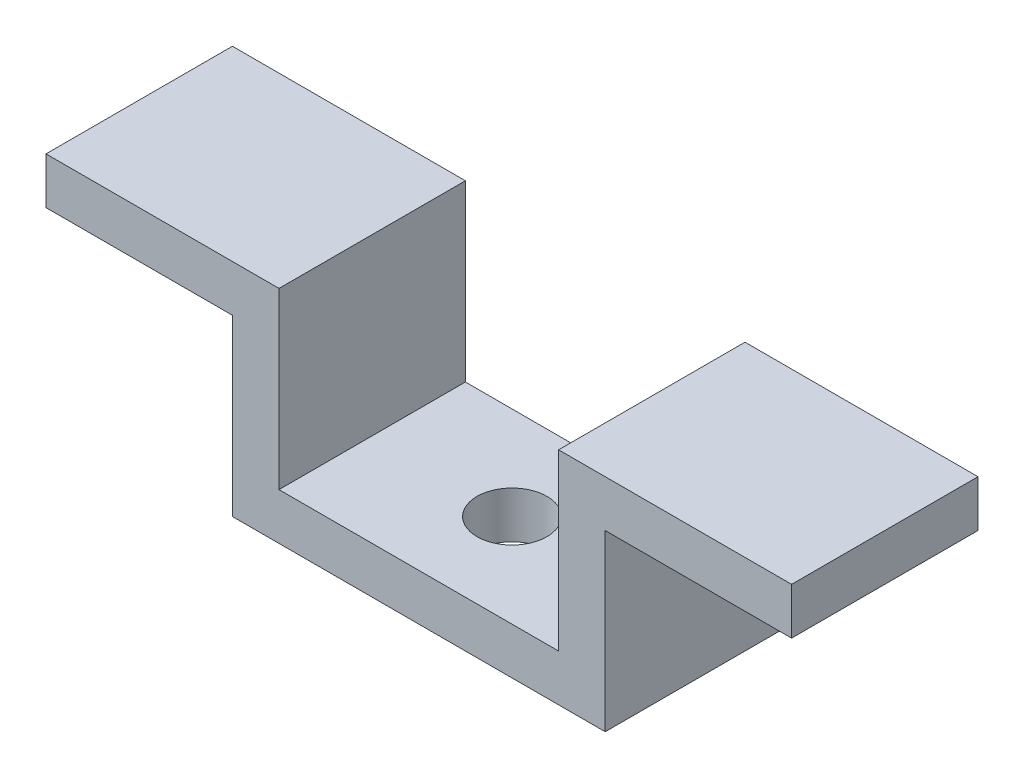
ISO-10303-21;
HEADER;
FILE_DESCRIPTION(('STEP AP214'),'2;1');
FILE_NAME('part.step','',(''),(''),'','','');
FILE_SCHEMA(('AUTOMOTIVE_DESIGN { 1 0 10303 214 1 1 1 1 }'));
ENDSEC;
DATA;
#1=APPLICATION_CONTEXT('core data for automotive mechanical design processes');
#2=APPLICATION_PROTOCOL_DEFINITION('international standard','automotive_design',2000,#1);
#3=PRODUCT_CONTEXT('',#1,'mechanical');
#4=PRODUCT('Part','Part','',(#3));
#5=PRODUCT_RELATED_PRODUCT_CATEGORY('part','',(#4));
#6=PRODUCT_DEFINITION_FORMATION('','',#4);
#7=PRODUCT_DEFINITION_CONTEXT('part definition',#1,'design');
#8=PRODUCT_DEFINITION('design','',#6,#7);
#9=PRODUCT_DEFINITION_SHAPE('','',#8);
#10=(LENGTH_UNIT() NAMED_UNIT(*) SI_UNIT(.MILLI.,.METRE.));
#11=(NAMED_UNIT(*) PLANE_ANGLE_UNIT() SI_UNIT($,.RADIAN.));
#12=(NAMED_UNIT(*) SI_UNIT($,.STERADIAN.) SOLID_ANGLE_UNIT());
#13=UNCERTAINTY_MEASURE_WITH_UNIT(LENGTH_MEASURE(1.E-05),#10,'distance_accuracy_value','');
#14=(GEOMETRIC_REPRESENTATION_CONTEXT(3) GLOBAL_UNCERTAINTY_ASSIGNED_CONTEXT((#13)) GLOBAL_UNIT_ASSIGNED_CONTEXT((#10,
#11,#12)) REPRESENTATION_CONTEXT('',''));
#15=CARTESIAN_POINT('',(0.,0.,0.));
#16=DIRECTION('',(0.,0.,1.));
#17=DIRECTION('',(1.,0.,0.));
#18=AXIS2_PLACEMENT_3D('',#15,#16,#17);
#19=CARTESIAN_POINT('',(0.,0.,25.4));
#20=DIRECTION('',(0.,1.,0.));
#21=DIRECTION('',(0.,0.,1.));
#22=AXIS2_PLACEMENT_3D('',#19,#20,#21);
#23=PLANE('',#22);
#24=CARTESIAN_POINT('',(0.,0.,12.7));
#25=DIRECTION('',(0.,1.,0.));
#26=DIRECTION('',(0.,0.,1.));
#27=AXIS2_PLACEMENT_3D('',#24,#25,#26);
#28=CIRCLE('',#27,4.7625);
#29=CARTESIAN_POINT('',(0.,0.,17.4625));
#30=VERTEX_POINT('',#29);
#31=EDGE_CURVE('E240',#30,#30,#28,.F.);
#32=ORIENTED_EDGE('',*,*,#31,.F.);
#33=EDGE_LOOP('',(#32));
#34=FACE_BOUND('',#33,.T.);
#35=DIRECTION('',(1.,0.,0.));
#36=VECTOR('',#35,1.);
#37=CARTESIAN_POINT('',(0.,0.,0.));
#38=LINE('',#37,#36);
#39=CARTESIAN_POINT('',(-25.4,0.,0.));
#40=VERTEX_POINT('',#39);
#41=CARTESIAN_POINT('',(25.4,0.,0.));
#42=VERTEX_POINT('',#41);
#43=EDGE_CURVE('E136',#40,#42,#38,.T.);
#44=ORIENTED_EDGE('',*,*,#43,.T.);
#45=DIRECTION('',(0.,0.,-1.));
#46=VECTOR('',#45,1.);
#47=CARTESIAN_POINT('',(25.4,0.,25.4));
#48=LINE('',#47,#46);
#49=CARTESIAN_POINT('',(25.4,0.,25.4));
#50=VERTEX_POINT('',#49);
#51=EDGE_CURVE('E11',#50,#42,#48,.T.);
#52=ORIENTED_EDGE('',*,*,#51,.F.);
#53=DIRECTION('',(1.,0.,0.));
#54=VECTOR('',#53,1.);
#55=CARTESIAN_POINT('',(0.,0.,25.4));
#56=LINE('',#55,#54);
#57=CARTESIAN_POINT('',(-25.4,0.,25.4));
#58=VERTEX_POINT('',#57);
#59=EDGE_CURVE('E94',#58,#50,#56,.T.);
#60=ORIENTED_EDGE('',*,*,#59,.F.);
#61=DIRECTION('',(0.,0.,-1.));
#62=VECTOR('',#61,1.);
#63=CARTESIAN_POINT('',(-25.4,0.,25.4));
#64=LINE('',#63,#62);
#65=EDGE_CURVE('E140',#58,#40,#64,.T.);
#66=ORIENTED_EDGE('',*,*,#65,.T.);
#67=EDGE_LOOP('',(#44,#52,#60,#66));
#68=FACE_BOUND('',#67,.T.);
#69=ADVANCED_FACE('F39',(#34,#68),#23,.F.);
#70=CARTESIAN_POINT('',(25.4,0.,25.4));
#71=DIRECTION('',(-1.,0.,0.));
#72=DIRECTION('',(0.,0.,1.));
#73=AXIS2_PLACEMENT_3D('',#70,#71,#72);
#74=PLANE('',#73);
#75=DIRECTION('',(0.,1.,0.));
#76=VECTOR('',#75,1.);
#77=CARTESIAN_POINT('',(25.4,0.,0.));
#78=LINE('',#77,#76);
#79=CARTESIAN_POINT('',(25.4,23.749,0.));
#80=VERTEX_POINT('',#79);
#81=EDGE_CURVE('E139',#42,#80,#78,.T.);
#82=ORIENTED_EDGE('',*,*,#81,.T.);
#83=DIRECTION('',(0.,0.,-1.));
#84=VECTOR('',#83,1.);
#85=CARTESIAN_POINT('',(25.4,23.749,25.4));
#86=LINE('',#85,#84);
#87=CARTESIAN_POINT('',(25.4,23.749,25.4));
#88=VERTEX_POINT('',#87);
#89=EDGE_CURVE('E48',#88,#80,#86,.T.);
#90=ORIENTED_EDGE('',*,*,#89,.F.);
#91=DIRECTION('',(0.,1.,0.));
#92=VECTOR('',#91,1.);
#93=CARTESIAN_POINT('',(25.4,0.,25.4));
#94=LINE('',#93,#92);
#95=EDGE_CURVE('E221',#50,#88,#94,.T.);
#96=ORIENTED_EDGE('',*,*,#95,.F.);
#97=ORIENTED_EDGE('',*,*,#51,.T.);
#98=EDGE_LOOP('',(#82,#90,#96,#97));
#99=FACE_BOUND('',#98,.T.);
#100=ADVANCED_FACE('F224',(#99),#74,.F.);
#101=CARTESIAN_POINT('',(25.4,23.749,25.4));
#102=DIRECTION('',(0.,1.,0.));
#103=DIRECTION('',(0.,0.,1.));
#104=AXIS2_PLACEMENT_3D('',#101,#102,#103);
#105=PLANE('',#104);
#106=DIRECTION('',(1.,0.,0.));
#107=VECTOR('',#106,1.);
#108=CARTESIAN_POINT('',(25.4,23.749,0.));
#109=LINE('',#108,#107);
#110=CARTESIAN_POINT('',(50.8,23.749,0.));
#111=VERTEX_POINT('',#110);
#112=EDGE_CURVE('E143',#80,#111,#109,.T.);
#113=ORIENTED_EDGE('',*,*,#112,.T.);
#114=DIRECTION('',(0.,0.,-1.));
#115=VECTOR('',#114,1.);
#116=CARTESIAN_POINT('',(50.8,23.749,25.4));
#117=LINE('',#116,#115);
#118=CARTESIAN_POINT('',(50.8,23.749,25.4));
#119=VERTEX_POINT('',#118);
#120=EDGE_CURVE('E122',#119,#111,#117,.T.);
#121=ORIENTED_EDGE('',*,*,#120,.F.);
#122=DIRECTION('',(1.,0.,0.));
#123=VECTOR('',#122,1.);
#124=CARTESIAN_POINT('',(25.4,23.749,25.4));
#125=LINE('',#124,#123);
#126=EDGE_CURVE('E111',#88,#119,#125,.T.);
#127=ORIENTED_EDGE('',*,*,#126,.F.);
#128=ORIENTED_EDGE('',*,*,#89,.T.);
#129=EDGE_LOOP('',(#113,#121,#127,#128));
#130=FACE_BOUND('',#129,.T.);
#131=ADVANCED_FACE('F166',(#130),#105,.F.);
#132=CARTESIAN_POINT('',(50.8,23.749,25.4));
#133=DIRECTION('',(-1.,0.,0.));
#134=DIRECTION('',(0.,0.,1.));
#135=AXIS2_PLACEMENT_3D('',#132,#133,#134);
#136=PLANE('',#135);
#137=DIRECTION('',(0.,1.,0.));
#138=VECTOR('',#137,1.);
#139=CARTESIAN_POINT('',(50.8,23.749,0.));
#140=LINE('',#139,#138);
#141=CARTESIAN_POINT('',(50.8,30.099,0.));
#142=VERTEX_POINT('',#141);
#143=EDGE_CURVE('E120',#111,#142,#140,.T.);
#144=ORIENTED_EDGE('',*,*,#143,.T.);
#145=DIRECTION('',(0.,0.,-1.));
#146=VECTOR('',#145,1.);
#147=CARTESIAN_POINT('',(50.8,30.099,25.4));
#148=LINE('',#147,#146);
#149=CARTESIAN_POINT('',(50.8,30.099,25.4));
#150=VERTEX_POINT('',#149);
#151=EDGE_CURVE('E117',#150,#142,#148,.T.);
#152=ORIENTED_EDGE('',*,*,#151,.F.);
#153=DIRECTION('',(0.,1.,0.));
#154=VECTOR('',#153,1.);
#155=CARTESIAN_POINT('',(50.8,23.749,25.4));
#156=LINE('',#155,#154);
#157=EDGE_CURVE('E105',#119,#150,#156,.T.);
#158=ORIENTED_EDGE('',*,*,#157,.F.);
#159=ORIENTED_EDGE('',*,*,#120,.T.);
#160=EDGE_LOOP('',(#144,#152,#158,#159));
#161=FACE_BOUND('',#160,.T.);
#162=ADVANCED_FACE('F118',(#161),#136,.F.);
#163=CARTESIAN_POINT('',(50.8,30.099,25.4));
#164=DIRECTION('',(0.,-1.,0.));
#165=DIRECTION('',(1.,0.,0.));
#166=AXIS2_PLACEMENT_3D('',#163,#164,#165);
#167=PLANE('',#166);
#168=DIRECTION('',(-1.,0.,0.));
#169=VECTOR('',#168,1.);
#170=CARTESIAN_POINT('',(50.8,30.099,0.));
#171=LINE('',#170,#169);
#172=CARTESIAN_POINT('',(19.05,30.099,0.));
#173=VERTEX_POINT('',#172);
#174=EDGE_CURVE('E80',#142,#173,#171,.T.);
#175=ORIENTED_EDGE('',*,*,#174,.T.);
#176=DIRECTION('',(0.,0.,-1.));
#177=VECTOR('',#176,1.);
#178=CARTESIAN_POINT('',(19.05,30.099,25.4));
#179=LINE('',#178,#177);
#180=CARTESIAN_POINT('',(19.05,30.099,25.4));
#181=VERTEX_POINT('',#180);
#182=EDGE_CURVE('E123',#181,#173,#179,.T.);
#183=ORIENTED_EDGE('',*,*,#182,.F.);
#184=DIRECTION('',(-1.,0.,0.));
#185=VECTOR('',#184,1.);
#186=CARTESIAN_POINT('',(50.8,30.099,25.4));
#187=LINE('',#186,#185);
#188=EDGE_CURVE('E109',#150,#181,#187,.T.);
#189=ORIENTED_EDGE('',*,*,#188,.F.);
#190=ORIENTED_EDGE('',*,*,#151,.T.);
#191=EDGE_LOOP('',(#175,#183,#189,#190));
#192=FACE_BOUND('',#191,.T.);
#193=ADVANCED_FACE('F125',(#192),#167,.F.);
#194=CARTESIAN_POINT('',(19.05,30.099,25.4));
#195=DIRECTION('',(1.,0.,0.));
#196=DIRECTION('',(0.,1.,0.));
#197=AXIS2_PLACEMENT_3D('',#194,#195,#196);
#198=PLANE('',#197);
#199=DIRECTION('',(0.,-1.,0.));
#200=VECTOR('',#199,1.);
#201=CARTESIAN_POINT('',(19.05,30.099,0.));
#202=LINE('',#201,#200);
#203=CARTESIAN_POINT('',(19.05,6.35,0.));
#204=VERTEX_POINT('',#203);
#205=EDGE_CURVE('E86',#173,#204,#202,.T.);
#206=ORIENTED_EDGE('',*,*,#205,.T.);
#207=DIRECTION('',(0.,0.,-1.));
#208=VECTOR('',#207,1.);
#209=CARTESIAN_POINT('',(19.05,6.35,25.4));
#210=LINE('',#209,#208);
#211=CARTESIAN_POINT('',(19.05,6.35,25.4));
#212=VERTEX_POINT('',#211);
#213=EDGE_CURVE('E135',#212,#204,#210,.T.);
#214=ORIENTED_EDGE('',*,*,#213,.F.);
#215=DIRECTION('',(0.,-1.,0.));
#216=VECTOR('',#215,1.);
#217=CARTESIAN_POINT('',(19.05,30.099,25.4));
#218=LINE('',#217,#216);
#219=EDGE_CURVE('E56',#181,#212,#218,.T.);
#220=ORIENTED_EDGE('',*,*,#219,.F.);
#221=ORIENTED_EDGE('',*,*,#182,.T.);
#222=EDGE_LOOP('',(#206,#214,#220,#221));
#223=FACE_BOUND('',#222,.T.);
#224=ADVANCED_FACE('F348',(#223),#198,.F.);
#225=CARTESIAN_POINT('',(19.05,6.35,25.4));
#226=DIRECTION('',(0.,-1.,0.));
#227=DIRECTION('',(1.,0.,0.));
#228=AXIS2_PLACEMENT_3D('',#225,#226,#227);
#229=PLANE('',#228);
#230=CARTESIAN_POINT('',(0.,6.35,12.7));
#231=DIRECTION('',(0.,1.,0.));
#232=DIRECTION('',(-1.,0.,0.));
#233=AXIS2_PLACEMENT_3D('',#230,#231,#232);
#234=CIRCLE('',#233,4.7625);
#235=CARTESIAN_POINT('',(-4.7625,6.35,12.7));
#236=VERTEX_POINT('',#235);
#237=EDGE_CURVE('E247',#236,#236,#234,.T.);
#238=ORIENTED_EDGE('',*,*,#237,.F.);
#239=EDGE_LOOP('',(#238));
#240=FACE_BOUND('',#239,.T.);
#241=DIRECTION('',(-1.,0.,0.));
#242=VECTOR('',#241,1.);
#243=CARTESIAN_POINT('',(19.05,6.35,0.));
#244=LINE('',#243,#242);
#245=CARTESIAN_POINT('',(-19.05,6.35,0.));
#246=VERTEX_POINT('',#245);
#247=EDGE_CURVE('E152',#204,#246,#244,.T.);
#248=ORIENTED_EDGE('',*,*,#247,.T.);
#249=DIRECTION('',(0.,0.,-1.));
#250=VECTOR('',#249,1.);
#251=CARTESIAN_POINT('',(-19.05,6.35,25.4));
#252=LINE('',#251,#250);
#253=CARTESIAN_POINT('',(-19.05,6.35,25.4));
#254=VERTEX_POINT('',#253);
#255=EDGE_CURVE('E183',#254,#246,#252,.T.);
#256=ORIENTED_EDGE('',*,*,#255,.F.);
#257=DIRECTION('',(-1.,0.,0.));
#258=VECTOR('',#257,1.);
#259=CARTESIAN_POINT('',(19.05,6.35,25.4));
#260=LINE('',#259,#258);
#261=EDGE_CURVE('E129',#212,#254,#260,.T.);
#262=ORIENTED_EDGE('',*,*,#261,.F.);
#263=ORIENTED_EDGE('',*,*,#213,.T.);
#264=EDGE_LOOP('',(#248,#256,#262,#263));
#265=FACE_BOUND('',#264,.T.);
#266=ADVANCED_FACE('F181',(#240,#265),#229,.F.);
#267=CARTESIAN_POINT('',(0.,0.,25.4));
#268=DIRECTION('',(0.,0.,1.));
#269=DIRECTION('',(1.,0.,0.));
#270=AXIS2_PLACEMENT_3D('',#267,#268,#269);
#271=PLANE('',#270);
#272=ORIENTED_EDGE('',*,*,#261,.T.);
#273=DIRECTION('',(0.,-1.,0.));
#274=VECTOR('',#273,1.);
#275=CARTESIAN_POINT('',(-19.05,30.099,25.4));
#276=LINE('',#275,#274);
#277=CARTESIAN_POINT('',(-19.05,30.099,25.4));
#278=VERTEX_POINT('',#277);
#279=EDGE_CURVE('E192',#278,#254,#276,.T.);
#280=ORIENTED_EDGE('',*,*,#279,.F.);
#281=DIRECTION('',(1.,0.,0.));
#282=VECTOR('',#281,1.);
#283=CARTESIAN_POINT('',(-50.8,30.099,25.4));
#284=LINE('',#283,#282);
#285=CARTESIAN_POINT('',(-50.8,30.099,25.4));
#286=VERTEX_POINT('',#285);
#287=EDGE_CURVE('E200',#286,#278,#284,.T.);
#288=ORIENTED_EDGE('',*,*,#287,.F.);
#289=DIRECTION('',(0.,1.,0.));
#290=VECTOR('',#289,1.);
#291=CARTESIAN_POINT('',(-50.8,23.749,25.4));
#292=LINE('',#291,#290);
#293=CARTESIAN_POINT('',(-50.8,23.749,25.4));
#294=VERTEX_POINT('',#293);
#295=EDGE_CURVE('E264',#294,#286,#292,.T.);
#296=ORIENTED_EDGE('',*,*,#295,.F.);
#297=DIRECTION('',(-1.,0.,0.));
#298=VECTOR('',#297,1.);
#299=CARTESIAN_POINT('',(-25.4,23.749,25.4));
#300=LINE('',#299,#298);
#301=CARTESIAN_POINT('',(-25.4,23.749,25.4));
#302=VERTEX_POINT('',#301);
#303=EDGE_CURVE('E259',#302,#294,#300,.T.);
#304=ORIENTED_EDGE('',*,*,#303,.F.);
#305=DIRECTION('',(0.,1.,0.));
#306=VECTOR('',#305,1.);
#307=CARTESIAN_POINT('',(-25.4,0.,25.4));
#308=LINE('',#307,#306);
#309=EDGE_CURVE('E257',#58,#302,#308,.T.);
#310=ORIENTED_EDGE('',*,*,#309,.F.);
#311=ORIENTED_EDGE('',*,*,#59,.T.);
#312=ORIENTED_EDGE('',*,*,#95,.T.);
#313=ORIENTED_EDGE('',*,*,#126,.T.);
#314=ORIENTED_EDGE('',*,*,#157,.T.);
#315=ORIENTED_EDGE('',*,*,#188,.T.);
#316=ORIENTED_EDGE('',*,*,#219,.T.);
#317=EDGE_LOOP('',(#272,#280,#288,#296,#304,#310,#311,#312,#313,#314,#315,#316));
#318=FACE_BOUND('',#317,.T.);
#319=ADVANCED_FACE('F107',(#318),#271,.T.);
#320=CARTESIAN_POINT('',(0.,0.,0.));
#321=DIRECTION('',(0.,0.,1.));
#322=DIRECTION('',(1.,0.,0.));
#323=AXIS2_PLACEMENT_3D('',#320,#321,#322);
#324=PLANE('',#323);
#325=ORIENTED_EDGE('',*,*,#43,.F.);
#326=DIRECTION('',(0.,1.,0.));
#327=VECTOR('',#326,1.);
#328=CARTESIAN_POINT('',(-25.4,0.,0.));
#329=LINE('',#328,#327);
#330=CARTESIAN_POINT('',(-25.4,23.749,0.));
#331=VERTEX_POINT('',#330);
#332=EDGE_CURVE('E232',#40,#331,#329,.T.);
#333=ORIENTED_EDGE('',*,*,#332,.T.);
#334=DIRECTION('',(-1.,0.,0.));
#335=VECTOR('',#334,1.);
#336=CARTESIAN_POINT('',(-25.4,23.749,0.));
#337=LINE('',#336,#335);
#338=CARTESIAN_POINT('',(-50.8,23.749,0.));
#339=VERTEX_POINT('',#338);
#340=EDGE_CURVE('E239',#331,#339,#337,.T.);
#341=ORIENTED_EDGE('',*,*,#340,.T.);
#342=DIRECTION('',(0.,1.,0.));
#343=VECTOR('',#342,1.);
#344=CARTESIAN_POINT('',(-50.8,23.749,0.));
#345=LINE('',#344,#343);
#346=CARTESIAN_POINT('',(-50.8,30.099,0.));
#347=VERTEX_POINT('',#346);
#348=EDGE_CURVE('E244',#339,#347,#345,.T.);
#349=ORIENTED_EDGE('',*,*,#348,.T.);
#350=DIRECTION('',(1.,0.,0.));
#351=VECTOR('',#350,1.);
#352=CARTESIAN_POINT('',(-50.8,30.099,0.));
#353=LINE('',#352,#351);
#354=CARTESIAN_POINT('',(-19.05,30.099,0.));
#355=VERTEX_POINT('',#354);
#356=EDGE_CURVE('E253',#347,#355,#353,.T.);
#357=ORIENTED_EDGE('',*,*,#356,.T.);
#358=DIRECTION('',(0.,-1.,0.));
#359=VECTOR('',#358,1.);
#360=CARTESIAN_POINT('',(-19.05,30.099,0.));
#361=LINE('',#360,#359);
#362=EDGE_CURVE('E177',#355,#246,#361,.T.);
#363=ORIENTED_EDGE('',*,*,#362,.T.);
#364=ORIENTED_EDGE('',*,*,#247,.F.);
#365=ORIENTED_EDGE('',*,*,#205,.F.);
#366=ORIENTED_EDGE('',*,*,#174,.F.);
#367=ORIENTED_EDGE('',*,*,#143,.F.);
#368=ORIENTED_EDGE('',*,*,#112,.F.);
#369=ORIENTED_EDGE('',*,*,#81,.F.);
#370=EDGE_LOOP('',(#325,#333,#341,#349,#357,#363,#364,#365,#366,#367,#368,#369));
#371=FACE_BOUND('',#370,.T.);
#372=ADVANCED_FACE('F172',(#371),#324,.F.);
#373=CARTESIAN_POINT('',(-25.4,0.,25.4));
#374=DIRECTION('',(1.,0.,0.));
#375=DIRECTION('',(0.,0.,1.));
#376=AXIS2_PLACEMENT_3D('',#373,#374,#375);
#377=PLANE('',#376);
#378=ORIENTED_EDGE('',*,*,#332,.F.);
#379=ORIENTED_EDGE('',*,*,#65,.F.);
#380=ORIENTED_EDGE('',*,*,#309,.T.);
#381=DIRECTION('',(0.,0.,-1.));
#382=VECTOR('',#381,1.);
#383=CARTESIAN_POINT('',(-25.4,23.749,25.4));
#384=LINE('',#383,#382);
#385=EDGE_CURVE('E212',#302,#331,#384,.T.);
#386=ORIENTED_EDGE('',*,*,#385,.T.);
#387=EDGE_LOOP('',(#378,#379,#380,#386));
#388=FACE_BOUND('',#387,.T.);
#389=ADVANCED_FACE('F235',(#388),#377,.F.);
#390=CARTESIAN_POINT('',(-25.4,23.749,25.4));
#391=DIRECTION('',(0.,1.,0.));
#392=DIRECTION('',(0.,0.,1.));
#393=AXIS2_PLACEMENT_3D('',#390,#391,#392);
#394=PLANE('',#393);
#395=ORIENTED_EDGE('',*,*,#340,.F.);
#396=ORIENTED_EDGE('',*,*,#385,.F.);
#397=ORIENTED_EDGE('',*,*,#303,.T.);
#398=DIRECTION('',(0.,0.,-1.));
#399=VECTOR('',#398,1.);
#400=CARTESIAN_POINT('',(-50.8,23.749,25.4));
#401=LINE('',#400,#399);
#402=EDGE_CURVE('E208',#294,#339,#401,.T.);
#403=ORIENTED_EDGE('',*,*,#402,.T.);
#404=EDGE_LOOP('',(#395,#396,#397,#403));
#405=FACE_BOUND('',#404,.T.);
#406=ADVANCED_FACE('F297',(#405),#394,.F.);
#407=CARTESIAN_POINT('',(-50.8,23.749,25.4));
#408=DIRECTION('',(1.,0.,0.));
#409=DIRECTION('',(0.,0.,1.));
#410=AXIS2_PLACEMENT_3D('',#407,#408,#409);
#411=PLANE('',#410);
#412=ORIENTED_EDGE('',*,*,#348,.F.);
#413=ORIENTED_EDGE('',*,*,#402,.F.);
#414=ORIENTED_EDGE('',*,*,#295,.T.);
#415=DIRECTION('',(0.,0.,-1.));
#416=VECTOR('',#415,1.);
#417=CARTESIAN_POINT('',(-50.8,30.099,25.4));
#418=LINE('',#417,#416);
#419=EDGE_CURVE('E198',#286,#347,#418,.T.);
#420=ORIENTED_EDGE('',*,*,#419,.T.);
#421=EDGE_LOOP('',(#412,#413,#414,#420));
#422=FACE_BOUND('',#421,.T.);
#423=ADVANCED_FACE('F295',(#422),#411,.F.);
#424=CARTESIAN_POINT('',(-50.8,30.099,25.4));
#425=DIRECTION('',(0.,-1.,0.));
#426=DIRECTION('',(-1.,0.,0.));
#427=AXIS2_PLACEMENT_3D('',#424,#425,#426);
#428=PLANE('',#427);
#429=ORIENTED_EDGE('',*,*,#356,.F.);
#430=ORIENTED_EDGE('',*,*,#419,.F.);
#431=ORIENTED_EDGE('',*,*,#287,.T.);
#432=DIRECTION('',(0.,0.,-1.));
#433=VECTOR('',#432,1.);
#434=CARTESIAN_POINT('',(-19.05,30.099,25.4));
#435=LINE('',#434,#433);
#436=EDGE_CURVE('E194',#278,#355,#435,.T.);
#437=ORIENTED_EDGE('',*,*,#436,.T.);
#438=EDGE_LOOP('',(#429,#430,#431,#437));
#439=FACE_BOUND('',#438,.T.);
#440=ADVANCED_FACE('F276',(#439),#428,.F.);
#441=CARTESIAN_POINT('',(-19.05,30.099,25.4));
#442=DIRECTION('',(-1.,0.,0.));
#443=DIRECTION('',(0.,1.,0.));
#444=AXIS2_PLACEMENT_3D('',#441,#442,#443);
#445=PLANE('',#444);
#446=ORIENTED_EDGE('',*,*,#362,.F.);
#447=ORIENTED_EDGE('',*,*,#436,.F.);
#448=ORIENTED_EDGE('',*,*,#279,.T.);
#449=ORIENTED_EDGE('',*,*,#255,.T.);
#450=EDGE_LOOP('',(#446,#447,#448,#449));
#451=FACE_BOUND('',#450,.T.);
#452=ADVANCED_FACE('F188',(#451),#445,.F.);
#453=CARTESIAN_POINT('',(0.,-0.00100000000000534,12.7));
#454=DIRECTION('',(0.,1.,0.));
#455=DIRECTION('',(-1.,0.,0.));
#456=AXIS2_PLACEMENT_3D('',#453,#454,#455);
#457=CYLINDRICAL_SURFACE('',#456,4.7625);
#458=ORIENTED_EDGE('',*,*,#237,.T.);
#459=EDGE_LOOP('',(#458));
#460=FACE_BOUND('',#459,.T.);
#461=ORIENTED_EDGE('',*,*,#31,.T.);
#462=EDGE_LOOP('',(#461));
#463=FACE_BOUND('',#462,.T.);
#464=ADVANCED_FACE('F314',(#460,#463),#457,.F.);
#465=CLOSED_SHELL('',(#69,#100,#131,#162,#193,#224,#266,#319,#372,#389,#406,#423,#440,#452,#464));
#466=MANIFOLD_SOLID_BREP('B2',#465);
#467=ADVANCED_BREP_SHAPE_REPRESENTATION('',(#18,#466),#14);
#468=SHAPE_DEFINITION_REPRESENTATION(#9,#467);
ENDSEC;
END-ISO-10303-21;
